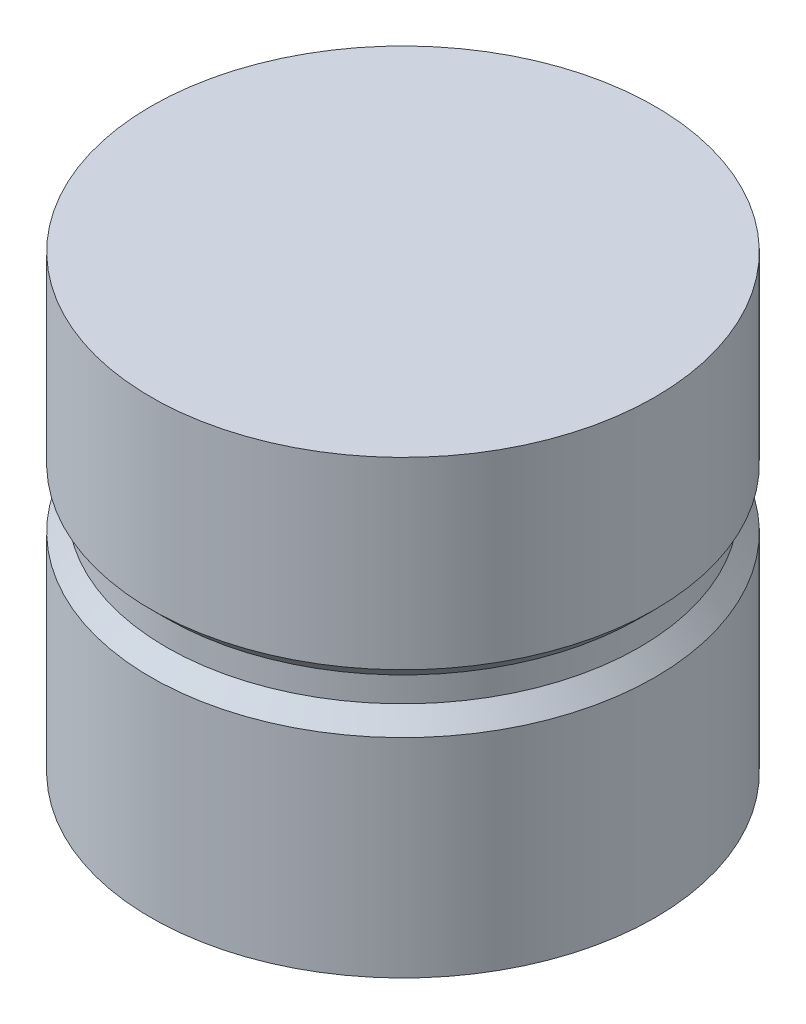
ISO-10303-21;
HEADER;
FILE_DESCRIPTION(('STEP AP214'),'2;1');
FILE_NAME('part.step','',(''),(''),'','','');
FILE_SCHEMA(('AUTOMOTIVE_DESIGN { 1 0 10303 214 1 1 1 1 }'));
ENDSEC;
DATA;
#1=APPLICATION_CONTEXT('core data for automotive mechanical design processes');
#2=APPLICATION_PROTOCOL_DEFINITION('international standard','automotive_design',2000,#1);
#3=PRODUCT_CONTEXT('',#1,'mechanical');
#4=PRODUCT('Part','Part','',(#3));
#5=PRODUCT_RELATED_PRODUCT_CATEGORY('part','',(#4));
#6=PRODUCT_DEFINITION_FORMATION('','',#4);
#7=PRODUCT_DEFINITION_CONTEXT('part definition',#1,'design');
#8=PRODUCT_DEFINITION('design','',#6,#7);
#9=PRODUCT_DEFINITION_SHAPE('','',#8);
#10=(LENGTH_UNIT() NAMED_UNIT(*) SI_UNIT(.MILLI.,.METRE.));
#11=(NAMED_UNIT(*) PLANE_ANGLE_UNIT() SI_UNIT($,.RADIAN.));
#12=(NAMED_UNIT(*) SI_UNIT($,.STERADIAN.) SOLID_ANGLE_UNIT());
#13=UNCERTAINTY_MEASURE_WITH_UNIT(LENGTH_MEASURE(1.E-05),#10,'distance_accuracy_value','');
#14=(GEOMETRIC_REPRESENTATION_CONTEXT(3) GLOBAL_UNCERTAINTY_ASSIGNED_CONTEXT((#13)) GLOBAL_UNIT_ASSIGNED_CONTEXT((#10,
#11,#12)) REPRESENTATION_CONTEXT('',''));
#15=CARTESIAN_POINT('',(0.,0.,0.));
#16=DIRECTION('',(0.,0.,1.));
#17=DIRECTION('',(1.,0.,0.));
#18=AXIS2_PLACEMENT_3D('',#15,#16,#17);
#19=CARTESIAN_POINT('',(0.,34.,0.));
#20=DIRECTION('',(0.,1.,0.));
#21=DIRECTION('',(-1.,0.,0.));
#22=AXIS2_PLACEMENT_3D('',#19,#20,#21);
#23=PLANE('',#22);
#24=CARTESIAN_POINT('',(0.,34.,0.));
#25=DIRECTION('',(0.,-1.,0.));
#26=DIRECTION('',(1.,0.,0.));
#27=AXIS2_PLACEMENT_3D('',#24,#25,#26);
#28=CIRCLE('',#27,19.);
#29=CARTESIAN_POINT('',(19.,34.,0.));
#30=VERTEX_POINT('',#29);
#31=EDGE_CURVE('E10',#30,#30,#28,.T.);
#32=ORIENTED_EDGE('',*,*,#31,.F.);
#33=EDGE_LOOP('',(#32));
#34=FACE_BOUND('',#33,.T.);
#35=ADVANCED_FACE('F35',(#34),#23,.T.);
#36=CARTESIAN_POINT('',(0.,32.2,0.));
#37=DIRECTION('',(0.,-1.,0.));
#38=DIRECTION('',(1.,0.,0.));
#39=AXIS2_PLACEMENT_3D('',#36,#37,#38);
#40=CYLINDRICAL_SURFACE('',#39,19.);
#41=ORIENTED_EDGE('',*,*,#31,.T.);
#42=EDGE_LOOP('',(#41));
#43=FACE_BOUND('',#42,.T.);
#44=CARTESIAN_POINT('',(0.,20.130385409973,0.));
#45=DIRECTION('',(0.,-1.,0.));
#46=DIRECTION('',(1.,0.,0.));
#47=AXIS2_PLACEMENT_3D('',#44,#45,#46);
#48=CIRCLE('',#47,19.);
#49=CARTESIAN_POINT('',(19.,20.1303854099731,0.));
#50=VERTEX_POINT('',#49);
#51=EDGE_CURVE('E41',#50,#50,#48,.T.);
#52=ORIENTED_EDGE('',*,*,#51,.F.);
#53=EDGE_LOOP('',(#52));
#54=FACE_BOUND('',#53,.T.);
#55=ADVANCED_FACE('F95',(#43,#54),#40,.T.);
#56=CARTESIAN_POINT('',(0.,18.9750646087918,0.));
#57=DIRECTION('',(0.,1.,0.));
#58=DIRECTION('',(-1.,0.,0.));
#59=AXIS2_PLACEMENT_3D('',#56,#57,#58);
#60=CONICAL_SURFACE('',#59,17.8446791988188,0.785398163397439);
#61=ORIENTED_EDGE('',*,*,#51,.T.);
#62=EDGE_LOOP('',(#61));
#63=FACE_BOUND('',#62,.T.);
#64=CARTESIAN_POINT('',(0.,18.9750646087918,0.));
#65=DIRECTION('',(0.,-1.,0.));
#66=DIRECTION('',(1.,0.,0.));
#67=AXIS2_PLACEMENT_3D('',#64,#65,#66);
#68=CIRCLE('',#67,17.8446791988188);
#69=CARTESIAN_POINT('',(17.8446791988188,18.9750646087918,0.));
#70=VERTEX_POINT('',#69);
#71=EDGE_CURVE('E45',#70,#70,#68,.T.);
#72=ORIENTED_EDGE('',*,*,#71,.F.);
#73=EDGE_LOOP('',(#72));
#74=FACE_BOUND('',#73,.T.);
#75=ADVANCED_FACE('F100',(#63,#74),#60,.T.);
#76=CARTESIAN_POINT('',(0.,32.2,0.));
#77=DIRECTION('',(0.,-1.,0.));
#78=DIRECTION('',(1.,0.,0.));
#79=AXIS2_PLACEMENT_3D('',#76,#77,#78);
#80=CYLINDRICAL_SURFACE('',#79,17.8446791988187);
#81=ORIENTED_EDGE('',*,*,#71,.T.);
#82=EDGE_LOOP('',(#81));
#83=FACE_BOUND('',#82,.T.);
#84=CARTESIAN_POINT('',(0.,17.0899364559259,0.));
#85=DIRECTION('',(0.,-1.,0.));
#86=DIRECTION('',(1.,0.,0.));
#87=AXIS2_PLACEMENT_3D('',#84,#85,#86);
#88=CIRCLE('',#87,17.8446791988187);
#89=CARTESIAN_POINT('',(17.8446791988188,17.0899364559259,0.));
#90=VERTEX_POINT('',#89);
#91=EDGE_CURVE('E49',#90,#90,#88,.T.);
#92=ORIENTED_EDGE('',*,*,#91,.F.);
#93=EDGE_LOOP('',(#92));
#94=FACE_BOUND('',#93,.T.);
#95=ADVANCED_FACE('F104',(#83,#94),#80,.T.);
#96=CARTESIAN_POINT('',(0.,15.7000169340757,0.));
#97=DIRECTION('',(0.,-1.,0.));
#98=DIRECTION('',(1.,0.,0.));
#99=AXIS2_PLACEMENT_3D('',#96,#97,#98);
#100=CONICAL_SURFACE('',#99,19.,0.693486318044859);
#101=ORIENTED_EDGE('',*,*,#91,.T.);
#102=EDGE_LOOP('',(#101));
#103=FACE_BOUND('',#102,.T.);
#104=CARTESIAN_POINT('',(0.,15.7000169340757,0.));
#105=DIRECTION('',(0.,-1.,0.));
#106=DIRECTION('',(1.,0.,0.));
#107=AXIS2_PLACEMENT_3D('',#104,#105,#106);
#108=CIRCLE('',#107,19.);
#109=CARTESIAN_POINT('',(19.,15.7000169340758,0.));
#110=VERTEX_POINT('',#109);
#111=EDGE_CURVE('E54',#110,#110,#108,.T.);
#112=ORIENTED_EDGE('',*,*,#111,.F.);
#113=EDGE_LOOP('',(#112));
#114=FACE_BOUND('',#113,.T.);
#115=ADVANCED_FACE('F110',(#103,#114),#100,.T.);
#116=CARTESIAN_POINT('',(0.,32.2,0.));
#117=DIRECTION('',(0.,-1.,0.));
#118=DIRECTION('',(1.,0.,0.));
#119=AXIS2_PLACEMENT_3D('',#116,#117,#118);
#120=CYLINDRICAL_SURFACE('',#119,19.);
#121=ORIENTED_EDGE('',*,*,#111,.T.);
#122=EDGE_LOOP('',(#121));
#123=FACE_BOUND('',#122,.T.);
#124=CARTESIAN_POINT('',(0.,0.,0.));
#125=DIRECTION('',(0.,-1.,0.));
#126=DIRECTION('',(1.,0.,0.));
#127=AXIS2_PLACEMENT_3D('',#124,#125,#126);
#128=CIRCLE('',#127,18.9999999999999);
#129=CARTESIAN_POINT('',(19.,0.,0.));
#130=VERTEX_POINT('',#129);
#131=EDGE_CURVE('E57',#130,#130,#128,.T.);
#132=ORIENTED_EDGE('',*,*,#131,.F.);
#133=EDGE_LOOP('',(#132));
#134=FACE_BOUND('',#133,.T.);
#135=ADVANCED_FACE('F114',(#123,#134),#120,.T.);
#136=CARTESIAN_POINT('',(19.,0.,0.));
#137=DIRECTION('',(0.,-1.,0.));
#138=DIRECTION('',(1.,0.,0.));
#139=AXIS2_PLACEMENT_3D('',#136,#137,#138);
#140=PLANE('',#139);
#141=ORIENTED_EDGE('',*,*,#131,.T.);
#142=EDGE_LOOP('',(#141));
#143=FACE_BOUND('',#142,.T.);
#144=CARTESIAN_POINT('',(0.,0.,0.));
#145=DIRECTION('',(0.,-1.,0.));
#146=DIRECTION('',(1.,0.,0.));
#147=AXIS2_PLACEMENT_3D('',#144,#145,#146);
#148=CIRCLE('',#147,17.1999999999999);
#149=CARTESIAN_POINT('',(17.2,0.,0.));
#150=VERTEX_POINT('',#149);
#151=EDGE_CURVE('E60',#150,#150,#148,.T.);
#152=ORIENTED_EDGE('',*,*,#151,.F.);
#153=EDGE_LOOP('',(#152));
#154=FACE_BOUND('',#153,.T.);
#155=ADVANCED_FACE('F118',(#143,#154),#140,.T.);
#156=CARTESIAN_POINT('',(0.,32.2,0.));
#157=DIRECTION('',(0.,-1.,0.));
#158=DIRECTION('',(1.,0.,0.));
#159=AXIS2_PLACEMENT_3D('',#156,#157,#158);
#160=CYLINDRICAL_SURFACE('',#159,17.2);
#161=ORIENTED_EDGE('',*,*,#151,.T.);
#162=EDGE_LOOP('',(#161));
#163=FACE_BOUND('',#162,.T.);
#164=CARTESIAN_POINT('',(0.,15.7000169340757,0.));
#165=DIRECTION('',(0.,-1.,0.));
#166=DIRECTION('',(1.,0.,0.));
#167=AXIS2_PLACEMENT_3D('',#164,#165,#166);
#168=CIRCLE('',#167,17.2);
#169=CARTESIAN_POINT('',(17.2,15.7000169340758,0.));
#170=VERTEX_POINT('',#169);
#171=EDGE_CURVE('E63',#170,#170,#168,.T.);
#172=ORIENTED_EDGE('',*,*,#171,.F.);
#173=EDGE_LOOP('',(#172));
#174=FACE_BOUND('',#173,.T.);
#175=ADVANCED_FACE('F122',(#163,#174),#160,.F.);
#176=CARTESIAN_POINT('',(0.,17.0899364559259,0.));
#177=DIRECTION('',(0.,-1.,0.));
#178=DIRECTION('',(1.,0.,0.));
#179=AXIS2_PLACEMENT_3D('',#176,#177,#178);
#180=CONICAL_SURFACE('',#179,16.0446791988188,0.693486318044859);
#181=ORIENTED_EDGE('',*,*,#171,.T.);
#182=EDGE_LOOP('',(#181));
#183=FACE_BOUND('',#182,.T.);
#184=CARTESIAN_POINT('',(0.,17.0899364559259,0.));
#185=DIRECTION('',(0.,-1.,0.));
#186=DIRECTION('',(1.,0.,0.));
#187=AXIS2_PLACEMENT_3D('',#184,#185,#186);
#188=CIRCLE('',#187,16.0446791988188);
#189=CARTESIAN_POINT('',(16.0446791988188,17.0899364559259,0.));
#190=VERTEX_POINT('',#189);
#191=EDGE_CURVE('E66',#190,#190,#188,.T.);
#192=ORIENTED_EDGE('',*,*,#191,.F.);
#193=EDGE_LOOP('',(#192));
#194=FACE_BOUND('',#193,.T.);
#195=ADVANCED_FACE('F126',(#183,#194),#180,.F.);
#196=CARTESIAN_POINT('',(0.,32.2,0.));
#197=DIRECTION('',(0.,-1.,0.));
#198=DIRECTION('',(1.,0.,0.));
#199=AXIS2_PLACEMENT_3D('',#196,#197,#198);
#200=CYLINDRICAL_SURFACE('',#199,16.0446791988188);
#201=ORIENTED_EDGE('',*,*,#191,.T.);
#202=EDGE_LOOP('',(#201));
#203=FACE_BOUND('',#202,.T.);
#204=CARTESIAN_POINT('',(0.,18.9750646087918,0.));
#205=DIRECTION('',(0.,-1.,0.));
#206=DIRECTION('',(1.,0.,0.));
#207=AXIS2_PLACEMENT_3D('',#204,#205,#206);
#208=CIRCLE('',#207,16.0446791988188);
#209=CARTESIAN_POINT('',(16.0446791988188,18.9750646087918,0.));
#210=VERTEX_POINT('',#209);
#211=EDGE_CURVE('E69',#210,#210,#208,.T.);
#212=ORIENTED_EDGE('',*,*,#211,.F.);
#213=EDGE_LOOP('',(#212));
#214=FACE_BOUND('',#213,.T.);
#215=ADVANCED_FACE('F91',(#203,#214),#200,.F.);
#216=CARTESIAN_POINT('',(0.,20.130385409973,0.));
#217=DIRECTION('',(0.,1.,0.));
#218=DIRECTION('',(-1.,0.,0.));
#219=AXIS2_PLACEMENT_3D('',#216,#217,#218);
#220=CONICAL_SURFACE('',#219,17.2,0.785398163397441);
#221=ORIENTED_EDGE('',*,*,#211,.T.);
#222=EDGE_LOOP('',(#221));
#223=FACE_BOUND('',#222,.T.);
#224=CARTESIAN_POINT('',(0.,20.130385409973,0.));
#225=DIRECTION('',(0.,-1.,0.));
#226=DIRECTION('',(1.,0.,0.));
#227=AXIS2_PLACEMENT_3D('',#224,#225,#226);
#228=CIRCLE('',#227,17.2);
#229=CARTESIAN_POINT('',(17.2,20.1303854099731,0.));
#230=VERTEX_POINT('',#229);
#231=EDGE_CURVE('E72',#230,#230,#228,.T.);
#232=ORIENTED_EDGE('',*,*,#231,.F.);
#233=EDGE_LOOP('',(#232));
#234=FACE_BOUND('',#233,.T.);
#235=ADVANCED_FACE('F83',(#223,#234),#220,.F.);
#236=CARTESIAN_POINT('',(0.,32.2,0.));
#237=DIRECTION('',(0.,-1.,0.));
#238=DIRECTION('',(1.,0.,0.));
#239=AXIS2_PLACEMENT_3D('',#236,#237,#238);
#240=CYLINDRICAL_SURFACE('',#239,17.2);
#241=ORIENTED_EDGE('',*,*,#231,.T.);
#242=EDGE_LOOP('',(#241));
#243=FACE_BOUND('',#242,.T.);
#244=CARTESIAN_POINT('',(0.,32.2,0.));
#245=DIRECTION('',(0.,-1.,0.));
#246=DIRECTION('',(1.,0.,0.));
#247=AXIS2_PLACEMENT_3D('',#244,#245,#246);
#248=CIRCLE('',#247,17.2);
#249=CARTESIAN_POINT('',(17.2,32.2,0.));
#250=VERTEX_POINT('',#249);
#251=EDGE_CURVE('E75',#250,#250,#248,.T.);
#252=ORIENTED_EDGE('',*,*,#251,.F.);
#253=EDGE_LOOP('',(#252));
#254=FACE_BOUND('',#253,.T.);
#255=ADVANCED_FACE('F81',(#243,#254),#240,.F.);
#256=CARTESIAN_POINT('',(17.2,32.2,0.));
#257=DIRECTION('',(0.,-1.,0.));
#258=DIRECTION('',(1.,0.,0.));
#259=AXIS2_PLACEMENT_3D('',#256,#257,#258);
#260=PLANE('',#259);
#261=ORIENTED_EDGE('',*,*,#251,.T.);
#262=EDGE_LOOP('',(#261));
#263=FACE_BOUND('',#262,.T.);
#264=ADVANCED_FACE('F79',(#263),#260,.T.);
#265=CLOSED_SHELL('',(#35,#55,#75,#95,#115,#135,#155,#175,#195,#215,#235,#255,#264));
#266=MANIFOLD_SOLID_BREP('B2',#265);
#267=ADVANCED_BREP_SHAPE_REPRESENTATION('',(#18,#266),#14);
#268=SHAPE_DEFINITION_REPRESENTATION(#9,#267);
ENDSEC;
END-ISO-10303-21;
